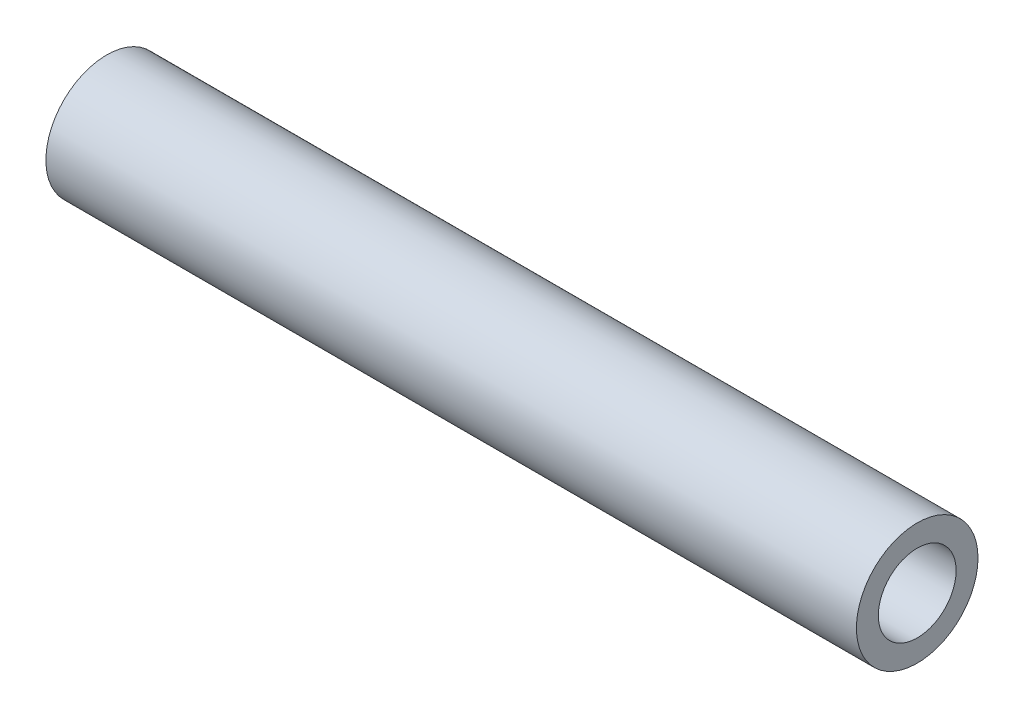
ISO-10303-21;
HEADER;
FILE_DESCRIPTION(('STEP AP214'),'2;1');
FILE_NAME('part.step','',(''),(''),'','','');
FILE_SCHEMA(('AUTOMOTIVE_DESIGN { 1 0 10303 214 1 1 1 1 }'));
ENDSEC;
DATA;
#1=APPLICATION_CONTEXT('core data for automotive mechanical design processes');
#2=APPLICATION_PROTOCOL_DEFINITION('international standard','automotive_design',2000,#1);
#3=PRODUCT_CONTEXT('',#1,'mechanical');
#4=PRODUCT('Part','Part','',(#3));
#5=PRODUCT_RELATED_PRODUCT_CATEGORY('part','',(#4));
#6=PRODUCT_DEFINITION_FORMATION('','',#4);
#7=PRODUCT_DEFINITION_CONTEXT('part definition',#1,'design');
#8=PRODUCT_DEFINITION('design','',#6,#7);
#9=PRODUCT_DEFINITION_SHAPE('','',#8);
#10=(LENGTH_UNIT() NAMED_UNIT(*) SI_UNIT(.MILLI.,.METRE.));
#11=(NAMED_UNIT(*) PLANE_ANGLE_UNIT() SI_UNIT($,.RADIAN.));
#12=(NAMED_UNIT(*) SI_UNIT($,.STERADIAN.) SOLID_ANGLE_UNIT());
#13=UNCERTAINTY_MEASURE_WITH_UNIT(LENGTH_MEASURE(1.E-05),#10,'distance_accuracy_value','');
#14=(GEOMETRIC_REPRESENTATION_CONTEXT(3) GLOBAL_UNCERTAINTY_ASSIGNED_CONTEXT((#13)) GLOBAL_UNIT_ASSIGNED_CONTEXT((#10,
#11,#12)) REPRESENTATION_CONTEXT('',''));
#15=CARTESIAN_POINT('',(0.,0.,0.));
#16=DIRECTION('',(0.,0.,1.));
#17=DIRECTION('',(1.,0.,0.));
#18=AXIS2_PLACEMENT_3D('',#15,#16,#17);
#19=CARTESIAN_POINT('',(50.8,0.,0.));
#20=DIRECTION('',(1.,0.,0.));
#21=DIRECTION('',(0.,0.,-1.));
#22=AXIS2_PLACEMENT_3D('',#19,#20,#21);
#23=PLANE('',#22);
#24=CARTESIAN_POINT('',(50.8,0.,0.));
#25=DIRECTION('',(1.,0.,0.));
#26=DIRECTION('',(0.,0.,-1.));
#27=AXIS2_PLACEMENT_3D('',#24,#25,#26);
#28=CIRCLE('',#27,3.81);
#29=CARTESIAN_POINT('',(50.8,0.,-3.81));
#30=VERTEX_POINT('',#29);
#31=EDGE_CURVE('E10',#30,#30,#28,.T.);
#32=ORIENTED_EDGE('',*,*,#31,.T.);
#33=EDGE_LOOP('',(#32));
#34=FACE_BOUND('',#33,.T.);
#35=CARTESIAN_POINT('',(50.8,0.,0.));
#36=DIRECTION('',(1.,0.,0.));
#37=DIRECTION('',(0.,0.,-1.));
#38=AXIS2_PLACEMENT_3D('',#35,#36,#37);
#39=CIRCLE('',#38,2.4384);
#40=CARTESIAN_POINT('',(50.8,0.,-2.4384));
#41=VERTEX_POINT('',#40);
#42=EDGE_CURVE('E44',#41,#41,#39,.T.);
#43=ORIENTED_EDGE('',*,*,#42,.F.);
#44=EDGE_LOOP('',(#43));
#45=FACE_BOUND('',#44,.T.);
#46=ADVANCED_FACE('F33',(#34,#45),#23,.T.);
#47=CARTESIAN_POINT('',(0.,0.,0.));
#48=DIRECTION('',(1.,0.,0.));
#49=DIRECTION('',(0.,0.,-1.));
#50=AXIS2_PLACEMENT_3D('',#47,#48,#49);
#51=PLANE('',#50);
#52=CARTESIAN_POINT('',(0.,0.,0.));
#53=DIRECTION('',(1.,0.,0.));
#54=DIRECTION('',(0.,0.,-1.));
#55=AXIS2_PLACEMENT_3D('',#52,#53,#54);
#56=CIRCLE('',#55,3.81);
#57=CARTESIAN_POINT('',(0.,0.,-3.81));
#58=VERTEX_POINT('',#57);
#59=EDGE_CURVE('E37',#58,#58,#56,.T.);
#60=ORIENTED_EDGE('',*,*,#59,.F.);
#61=EDGE_LOOP('',(#60));
#62=FACE_BOUND('',#61,.T.);
#63=CARTESIAN_POINT('',(0.,0.,0.));
#64=DIRECTION('',(1.,0.,0.));
#65=DIRECTION('',(0.,0.,-1.));
#66=AXIS2_PLACEMENT_3D('',#63,#64,#65);
#67=CIRCLE('',#66,2.4384);
#68=CARTESIAN_POINT('',(0.,0.,-2.4384));
#69=VERTEX_POINT('',#68);
#70=EDGE_CURVE('E46',#69,#69,#67,.T.);
#71=ORIENTED_EDGE('',*,*,#70,.T.);
#72=EDGE_LOOP('',(#71));
#73=FACE_BOUND('',#72,.T.);
#74=ADVANCED_FACE('F56',(#62,#73),#51,.F.);
#75=CARTESIAN_POINT('',(50.8,0.,0.));
#76=DIRECTION('',(-1.,0.,0.));
#77=DIRECTION('',(0.,0.,1.));
#78=AXIS2_PLACEMENT_3D('',#75,#76,#77);
#79=CYLINDRICAL_SURFACE('',#78,3.81);
#80=ORIENTED_EDGE('',*,*,#31,.F.);
#81=EDGE_LOOP('',(#80));
#82=FACE_BOUND('',#81,.T.);
#83=ORIENTED_EDGE('',*,*,#59,.T.);
#84=EDGE_LOOP('',(#83));
#85=FACE_BOUND('',#84,.T.);
#86=ADVANCED_FACE('F35',(#82,#85),#79,.T.);
#87=CARTESIAN_POINT('',(50.8,0.,0.));
#88=DIRECTION('',(-1.,0.,0.));
#89=DIRECTION('',(0.,0.,1.));
#90=AXIS2_PLACEMENT_3D('',#87,#88,#89);
#91=CYLINDRICAL_SURFACE('',#90,2.4384);
#92=ORIENTED_EDGE('',*,*,#42,.T.);
#93=EDGE_LOOP('',(#92));
#94=FACE_BOUND('',#93,.T.);
#95=ORIENTED_EDGE('',*,*,#70,.F.);
#96=EDGE_LOOP('',(#95));
#97=FACE_BOUND('',#96,.T.);
#98=ADVANCED_FACE('F52',(#94,#97),#91,.F.);
#99=CLOSED_SHELL('',(#46,#74,#86,#98));
#100=MANIFOLD_SOLID_BREP('B2',#99);
#101=ADVANCED_BREP_SHAPE_REPRESENTATION('',(#18,#100),#14);
#102=SHAPE_DEFINITION_REPRESENTATION(#9,#101);
ENDSEC;
END-ISO-10303-21;
